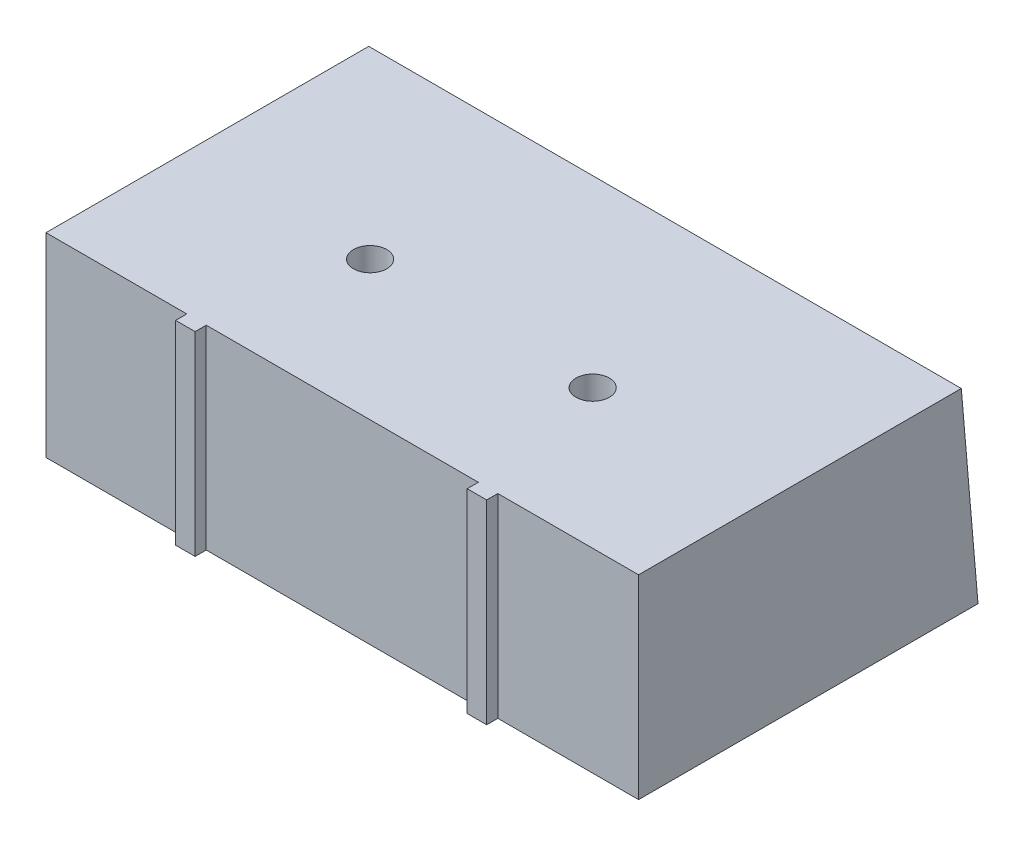
ISO-10303-21;
HEADER;
FILE_DESCRIPTION(('STEP AP214'),'2;1');
FILE_NAME('part.step','',(''),(''),'','','');
FILE_SCHEMA(('AUTOMOTIVE_DESIGN { 1 0 10303 214 1 1 1 1 }'));
ENDSEC;
DATA;
#1=APPLICATION_CONTEXT('core data for automotive mechanical design processes');
#2=APPLICATION_PROTOCOL_DEFINITION('international standard','automotive_design',2000,#1);
#3=PRODUCT_CONTEXT('',#1,'mechanical');
#4=PRODUCT('Part','Part','',(#3));
#5=PRODUCT_RELATED_PRODUCT_CATEGORY('part','',(#4));
#6=PRODUCT_DEFINITION_FORMATION('','',#4);
#7=PRODUCT_DEFINITION_CONTEXT('part definition',#1,'design');
#8=PRODUCT_DEFINITION('design','',#6,#7);
#9=PRODUCT_DEFINITION_SHAPE('','',#8);
#10=(LENGTH_UNIT() NAMED_UNIT(*) SI_UNIT(.MILLI.,.METRE.));
#11=(NAMED_UNIT(*) PLANE_ANGLE_UNIT() SI_UNIT($,.RADIAN.));
#12=(NAMED_UNIT(*) SI_UNIT($,.STERADIAN.) SOLID_ANGLE_UNIT());
#13=UNCERTAINTY_MEASURE_WITH_UNIT(LENGTH_MEASURE(1.E-05),#10,'distance_accuracy_value','');
#14=(GEOMETRIC_REPRESENTATION_CONTEXT(3) GLOBAL_UNCERTAINTY_ASSIGNED_CONTEXT((#13)) GLOBAL_UNIT_ASSIGNED_CONTEXT((#10,
#11,#12)) REPRESENTATION_CONTEXT('',''));
#15=CARTESIAN_POINT('',(0.,0.,0.));
#16=DIRECTION('',(0.,0.,1.));
#17=DIRECTION('',(1.,0.,0.));
#18=AXIS2_PLACEMENT_3D('',#15,#16,#17);
#19=CARTESIAN_POINT('',(0.,35.,0.));
#20=DIRECTION('',(0.,-1.,0.));
#21=DIRECTION('',(0.,0.,-1.));
#22=AXIS2_PLACEMENT_3D('',#19,#20,#21);
#23=PLANE('',#22);
#24=DIRECTION('',(0.,0.,-1.));
#25=VECTOR('',#24,1.);
#26=CARTESIAN_POINT('',(106.5,35.,0.));
#27=LINE('',#26,#25);
#28=CARTESIAN_POINT('',(106.5,35.,0.));
#29=VERTEX_POINT('',#28);
#30=CARTESIAN_POINT('',(106.5,35.,-58.));
#31=VERTEX_POINT('',#30);
#32=EDGE_CURVE('E169',#29,#31,#27,.T.);
#33=ORIENTED_EDGE('',*,*,#32,.T.);
#34=DIRECTION('',(-1.,0.,0.));
#35=VECTOR('',#34,1.);
#36=CARTESIAN_POINT('',(106.5,35.,-58.));
#37=LINE('',#36,#35);
#38=CARTESIAN_POINT('',(0.,35.,-58.));
#39=VERTEX_POINT('',#38);
#40=EDGE_CURVE('E291',#31,#39,#37,.T.);
#41=ORIENTED_EDGE('',*,*,#40,.T.);
#42=DIRECTION('',(0.,0.,1.));
#43=VECTOR('',#42,1.);
#44=CARTESIAN_POINT('',(0.,35.,0.));
#45=LINE('',#44,#43);
#46=CARTESIAN_POINT('',(0.,35.,0.));
#47=VERTEX_POINT('',#46);
#48=EDGE_CURVE('E119',#39,#47,#45,.T.);
#49=ORIENTED_EDGE('',*,*,#48,.T.);
#50=DIRECTION('',(1.,0.,0.));
#51=VECTOR('',#50,1.);
#52=CARTESIAN_POINT('',(0.,35.,0.));
#53=LINE('',#52,#51);
#54=CARTESIAN_POINT('',(25.3,35.,0.));
#55=VERTEX_POINT('',#54);
#56=EDGE_CURVE('E257',#47,#55,#53,.T.);
#57=ORIENTED_EDGE('',*,*,#56,.T.);
#58=DIRECTION('',(0.,0.,1.));
#59=VECTOR('',#58,1.);
#60=CARTESIAN_POINT('',(25.3,35.,0.));
#61=LINE('',#60,#59);
#62=CARTESIAN_POINT('',(25.3,35.,2.));
#63=VERTEX_POINT('',#62);
#64=EDGE_CURVE('E260',#55,#63,#61,.T.);
#65=ORIENTED_EDGE('',*,*,#64,.T.);
#66=DIRECTION('',(1.,0.,0.));
#67=VECTOR('',#66,1.);
#68=CARTESIAN_POINT('',(25.3,35.,2.));
#69=LINE('',#68,#67);
#70=CARTESIAN_POINT('',(28.8,35.,2.));
#71=VERTEX_POINT('',#70);
#72=EDGE_CURVE('E263',#63,#71,#69,.T.);
#73=ORIENTED_EDGE('',*,*,#72,.T.);
#74=DIRECTION('',(0.,0.,-1.));
#75=VECTOR('',#74,1.);
#76=CARTESIAN_POINT('',(28.8,35.,2.));
#77=LINE('',#76,#75);
#78=CARTESIAN_POINT('',(28.8,35.,0.));
#79=VERTEX_POINT('',#78);
#80=EDGE_CURVE('E266',#71,#79,#77,.T.);
#81=ORIENTED_EDGE('',*,*,#80,.T.);
#82=DIRECTION('',(1.,0.,0.));
#83=VECTOR('',#82,1.);
#84=CARTESIAN_POINT('',(28.8,35.,0.));
#85=LINE('',#84,#83);
#86=CARTESIAN_POINT('',(77.7,35.,0.));
#87=VERTEX_POINT('',#86);
#88=EDGE_CURVE('E269',#79,#87,#85,.T.);
#89=ORIENTED_EDGE('',*,*,#88,.T.);
#90=DIRECTION('',(0.,0.,1.));
#91=VECTOR('',#90,1.);
#92=CARTESIAN_POINT('',(77.7,35.,1.99999999999999));
#93=LINE('',#92,#91);
#94=CARTESIAN_POINT('',(77.7,35.,1.99999999999999));
#95=VERTEX_POINT('',#94);
#96=EDGE_CURVE('E148',#87,#95,#93,.T.);
#97=ORIENTED_EDGE('',*,*,#96,.T.);
#98=DIRECTION('',(1.,0.,0.));
#99=VECTOR('',#98,1.);
#100=CARTESIAN_POINT('',(81.2,35.,1.99999999999999));
#101=LINE('',#100,#99);
#102=CARTESIAN_POINT('',(81.2,35.,1.99999999999999));
#103=VERTEX_POINT('',#102);
#104=EDGE_CURVE('E141',#95,#103,#101,.T.);
#105=ORIENTED_EDGE('',*,*,#104,.T.);
#106=DIRECTION('',(0.,0.,-1.));
#107=VECTOR('',#106,1.);
#108=CARTESIAN_POINT('',(81.2,35.,0.));
#109=LINE('',#108,#107);
#110=CARTESIAN_POINT('',(81.2,35.,0.));
#111=VERTEX_POINT('',#110);
#112=EDGE_CURVE('E145',#103,#111,#109,.T.);
#113=ORIENTED_EDGE('',*,*,#112,.T.);
#114=DIRECTION('',(1.,0.,0.));
#115=VECTOR('',#114,1.);
#116=CARTESIAN_POINT('',(81.2,35.,0.));
#117=LINE('',#116,#115);
#118=EDGE_CURVE('E65',#111,#29,#117,.T.);
#119=ORIENTED_EDGE('',*,*,#118,.T.);
#120=EDGE_LOOP('',(#33,#41,#49,#57,#65,#73,#81,#89,#97,#105,#113,#119));
#121=FACE_BOUND('',#120,.T.);
#122=CARTESIAN_POINT('',(33.25,35.,-25.));
#123=DIRECTION('',(0.,1.,0.));
#124=DIRECTION('',(0.,0.,1.));
#125=AXIS2_PLACEMENT_3D('',#122,#123,#124);
#126=CIRCLE('',#125,3.);
#127=CARTESIAN_POINT('',(33.25,35.,-22.));
#128=VERTEX_POINT('',#127);
#129=EDGE_CURVE('E236',#128,#128,#126,.T.);
#130=ORIENTED_EDGE('',*,*,#129,.F.);
#131=EDGE_LOOP('',(#130));
#132=FACE_BOUND('',#131,.T.);
#133=CARTESIAN_POINT('',(73.25,35.,-25.));
#134=DIRECTION('',(0.,1.,0.));
#135=DIRECTION('',(0.,0.,-1.));
#136=AXIS2_PLACEMENT_3D('',#133,#134,#135);
#137=CIRCLE('',#136,3.00000000000001);
#138=CARTESIAN_POINT('',(73.25,35.,-28.));
#139=VERTEX_POINT('',#138);
#140=EDGE_CURVE('E249',#139,#139,#137,.T.);
#141=ORIENTED_EDGE('',*,*,#140,.F.);
#142=EDGE_LOOP('',(#141));
#143=FACE_BOUND('',#142,.T.);
#144=ADVANCED_FACE('F45',(#121,#132,#143),#23,.F.);
#145=CARTESIAN_POINT('',(0.,0.,0.));
#146=DIRECTION('',(0.,-1.,0.));
#147=DIRECTION('',(0.,0.,-1.));
#148=AXIS2_PLACEMENT_3D('',#145,#146,#147);
#149=PLANE('',#148);
#150=CARTESIAN_POINT('',(33.25,0.,-25.));
#151=DIRECTION('',(0.,1.,0.));
#152=DIRECTION('',(0.,0.,1.));
#153=AXIS2_PLACEMENT_3D('',#150,#151,#152);
#154=CIRCLE('',#153,3.);
#155=CARTESIAN_POINT('',(33.25,0.,-22.));
#156=VERTEX_POINT('',#155);
#157=EDGE_CURVE('E243',#156,#156,#154,.T.);
#158=ORIENTED_EDGE('',*,*,#157,.T.);
#159=EDGE_LOOP('',(#158));
#160=FACE_BOUND('',#159,.T.);
#161=DIRECTION('',(0.,0.,1.));
#162=VECTOR('',#161,1.);
#163=CARTESIAN_POINT('',(0.,0.,0.));
#164=LINE('',#163,#162);
#165=CARTESIAN_POINT('',(0.,0.,-61.));
#166=VERTEX_POINT('',#165);
#167=CARTESIAN_POINT('',(0.,0.,0.));
#168=VERTEX_POINT('',#167);
#169=EDGE_CURVE('E180',#166,#168,#164,.T.);
#170=ORIENTED_EDGE('',*,*,#169,.F.);
#171=DIRECTION('',(-1.,0.,0.));
#172=VECTOR('',#171,1.);
#173=CARTESIAN_POINT('',(0.,0.,-61.));
#174=LINE('',#173,#172);
#175=CARTESIAN_POINT('',(106.5,0.,-61.));
#176=VERTEX_POINT('',#175);
#177=EDGE_CURVE('E205',#176,#166,#174,.T.);
#178=ORIENTED_EDGE('',*,*,#177,.F.);
#179=DIRECTION('',(0.,0.,-1.));
#180=VECTOR('',#179,1.);
#181=CARTESIAN_POINT('',(106.5,0.,0.));
#182=LINE('',#181,#180);
#183=CARTESIAN_POINT('',(106.5,0.,0.));
#184=VERTEX_POINT('',#183);
#185=EDGE_CURVE('E202',#184,#176,#182,.T.);
#186=ORIENTED_EDGE('',*,*,#185,.F.);
#187=DIRECTION('',(1.,0.,0.));
#188=VECTOR('',#187,1.);
#189=CARTESIAN_POINT('',(81.2,0.,0.));
#190=LINE('',#189,#188);
#191=CARTESIAN_POINT('',(81.2,0.,0.));
#192=VERTEX_POINT('',#191);
#193=EDGE_CURVE('E103',#192,#184,#190,.T.);
#194=ORIENTED_EDGE('',*,*,#193,.F.);
#195=DIRECTION('',(0.,0.,-1.));
#196=VECTOR('',#195,1.);
#197=CARTESIAN_POINT('',(81.2,0.,0.));
#198=LINE('',#197,#196);
#199=CARTESIAN_POINT('',(81.2,0.,1.99999999999999));
#200=VERTEX_POINT('',#199);
#201=EDGE_CURVE('E197',#200,#192,#198,.T.);
#202=ORIENTED_EDGE('',*,*,#201,.F.);
#203=DIRECTION('',(1.,0.,0.));
#204=VECTOR('',#203,1.);
#205=CARTESIAN_POINT('',(81.2,0.,1.99999999999999));
#206=LINE('',#205,#204);
#207=CARTESIAN_POINT('',(77.7,0.,1.99999999999999));
#208=VERTEX_POINT('',#207);
#209=EDGE_CURVE('E158',#208,#200,#206,.T.);
#210=ORIENTED_EDGE('',*,*,#209,.F.);
#211=DIRECTION('',(0.,0.,1.));
#212=VECTOR('',#211,1.);
#213=CARTESIAN_POINT('',(77.7,0.,1.99999999999999));
#214=LINE('',#213,#212);
#215=CARTESIAN_POINT('',(77.7,0.,0.));
#216=VERTEX_POINT('',#215);
#217=EDGE_CURVE('E192',#216,#208,#214,.T.);
#218=ORIENTED_EDGE('',*,*,#217,.F.);
#219=DIRECTION('',(1.,0.,0.));
#220=VECTOR('',#219,1.);
#221=CARTESIAN_POINT('',(28.8,0.,0.));
#222=LINE('',#221,#220);
#223=CARTESIAN_POINT('',(28.8,0.,0.));
#224=VERTEX_POINT('',#223);
#225=EDGE_CURVE('E189',#224,#216,#222,.T.);
#226=ORIENTED_EDGE('',*,*,#225,.F.);
#227=DIRECTION('',(0.,0.,-1.));
#228=VECTOR('',#227,1.);
#229=CARTESIAN_POINT('',(28.8,0.,2.));
#230=LINE('',#229,#228);
#231=CARTESIAN_POINT('',(28.8,0.,2.));
#232=VERTEX_POINT('',#231);
#233=EDGE_CURVE('E186',#232,#224,#230,.T.);
#234=ORIENTED_EDGE('',*,*,#233,.F.);
#235=DIRECTION('',(1.,0.,0.));
#236=VECTOR('',#235,1.);
#237=CARTESIAN_POINT('',(25.3,0.,2.));
#238=LINE('',#237,#236);
#239=CARTESIAN_POINT('',(25.3,0.,2.));
#240=VERTEX_POINT('',#239);
#241=EDGE_CURVE('E183',#240,#232,#238,.T.);
#242=ORIENTED_EDGE('',*,*,#241,.F.);
#243=DIRECTION('',(0.,0.,1.));
#244=VECTOR('',#243,1.);
#245=CARTESIAN_POINT('',(25.3,0.,0.));
#246=LINE('',#245,#244);
#247=CARTESIAN_POINT('',(25.3,0.,0.));
#248=VERTEX_POINT('',#247);
#249=EDGE_CURVE('E179',#248,#240,#246,.T.);
#250=ORIENTED_EDGE('',*,*,#249,.F.);
#251=DIRECTION('',(1.,0.,0.));
#252=VECTOR('',#251,1.);
#253=CARTESIAN_POINT('',(0.,0.,0.));
#254=LINE('',#253,#252);
#255=EDGE_CURVE('E176',#168,#248,#254,.T.);
#256=ORIENTED_EDGE('',*,*,#255,.F.);
#257=EDGE_LOOP('',(#170,#178,#186,#194,#202,#210,#218,#226,#234,#242,#250,#256));
#258=FACE_BOUND('',#257,.T.);
#259=CARTESIAN_POINT('',(73.25,0.,-25.));
#260=DIRECTION('',(0.,1.,0.));
#261=DIRECTION('',(0.,0.,-1.));
#262=AXIS2_PLACEMENT_3D('',#259,#260,#261);
#263=CIRCLE('',#262,3.00000000000001);
#264=CARTESIAN_POINT('',(73.25,0.,-28.));
#265=VERTEX_POINT('',#264);
#266=EDGE_CURVE('E252',#265,#265,#263,.T.);
#267=ORIENTED_EDGE('',*,*,#266,.T.);
#268=EDGE_LOOP('',(#267));
#269=FACE_BOUND('',#268,.T.);
#270=ADVANCED_FACE('F283',(#160,#258,#269),#149,.T.);
#271=CARTESIAN_POINT('',(0.,35.,0.));
#272=DIRECTION('',(1.,0.,0.));
#273=DIRECTION('',(0.,0.,-1.));
#274=AXIS2_PLACEMENT_3D('',#271,#272,#273);
#275=PLANE('',#274);
#276=ORIENTED_EDGE('',*,*,#48,.F.);
#277=DIRECTION('',(0.,-0.996346649041751,-0.0854011413464359));
#278=VECTOR('',#277,1.);
#279=CARTESIAN_POINT('',(0.,39.935170178282,-57.5769854132901));
#280=LINE('',#279,#278);
#281=EDGE_CURVE('E297',#39,#166,#280,.T.);
#282=ORIENTED_EDGE('',*,*,#281,.T.);
#283=ORIENTED_EDGE('',*,*,#169,.T.);
#284=DIRECTION('',(0.,-1.,0.));
#285=VECTOR('',#284,1.);
#286=CARTESIAN_POINT('',(0.,35.,0.));
#287=LINE('',#286,#285);
#288=EDGE_CURVE('E11',#47,#168,#287,.T.);
#289=ORIENTED_EDGE('',*,*,#288,.F.);
#290=EDGE_LOOP('',(#276,#282,#283,#289));
#291=FACE_BOUND('',#290,.T.);
#292=ADVANCED_FACE('F47',(#291),#275,.F.);
#293=CARTESIAN_POINT('',(0.,35.,0.));
#294=DIRECTION('',(0.,0.,-1.));
#295=DIRECTION('',(-1.,0.,0.));
#296=AXIS2_PLACEMENT_3D('',#293,#294,#295);
#297=PLANE('',#296);
#298=ORIENTED_EDGE('',*,*,#255,.T.);
#299=DIRECTION('',(0.,-1.,0.));
#300=VECTOR('',#299,1.);
#301=CARTESIAN_POINT('',(25.3,35.,0.));
#302=LINE('',#301,#300);
#303=EDGE_CURVE('E56',#55,#248,#302,.T.);
#304=ORIENTED_EDGE('',*,*,#303,.F.);
#305=ORIENTED_EDGE('',*,*,#56,.F.);
#306=ORIENTED_EDGE('',*,*,#288,.T.);
#307=EDGE_LOOP('',(#298,#304,#305,#306));
#308=FACE_BOUND('',#307,.T.);
#309=ADVANCED_FACE('F304',(#308),#297,.F.);
#310=CARTESIAN_POINT('',(25.3,35.,0.));
#311=DIRECTION('',(1.,0.,0.));
#312=DIRECTION('',(0.,0.,-1.));
#313=AXIS2_PLACEMENT_3D('',#310,#311,#312);
#314=PLANE('',#313);
#315=ORIENTED_EDGE('',*,*,#249,.T.);
#316=DIRECTION('',(0.,-1.,0.));
#317=VECTOR('',#316,1.);
#318=CARTESIAN_POINT('',(25.3,35.,2.));
#319=LINE('',#318,#317);
#320=EDGE_CURVE('E224',#63,#240,#319,.T.);
#321=ORIENTED_EDGE('',*,*,#320,.F.);
#322=ORIENTED_EDGE('',*,*,#64,.F.);
#323=ORIENTED_EDGE('',*,*,#303,.T.);
#324=EDGE_LOOP('',(#315,#321,#322,#323));
#325=FACE_BOUND('',#324,.T.);
#326=ADVANCED_FACE('F310',(#325),#314,.F.);
#327=CARTESIAN_POINT('',(25.3,35.,2.));
#328=DIRECTION('',(0.,0.,-1.));
#329=DIRECTION('',(-1.,0.,0.));
#330=AXIS2_PLACEMENT_3D('',#327,#328,#329);
#331=PLANE('',#330);
#332=ORIENTED_EDGE('',*,*,#241,.T.);
#333=DIRECTION('',(0.,-1.,0.));
#334=VECTOR('',#333,1.);
#335=CARTESIAN_POINT('',(28.8,35.,2.));
#336=LINE('',#335,#334);
#337=EDGE_CURVE('E220',#71,#232,#336,.T.);
#338=ORIENTED_EDGE('',*,*,#337,.F.);
#339=ORIENTED_EDGE('',*,*,#72,.F.);
#340=ORIENTED_EDGE('',*,*,#320,.T.);
#341=EDGE_LOOP('',(#332,#338,#339,#340));
#342=FACE_BOUND('',#341,.T.);
#343=ADVANCED_FACE('F312',(#342),#331,.F.);
#344=CARTESIAN_POINT('',(28.8,35.,2.));
#345=DIRECTION('',(-1.,0.,0.));
#346=DIRECTION('',(0.,0.,1.));
#347=AXIS2_PLACEMENT_3D('',#344,#345,#346);
#348=PLANE('',#347);
#349=ORIENTED_EDGE('',*,*,#233,.T.);
#350=DIRECTION('',(0.,-1.,0.));
#351=VECTOR('',#350,1.);
#352=CARTESIAN_POINT('',(28.8,35.,0.));
#353=LINE('',#352,#351);
#354=EDGE_CURVE('E216',#79,#224,#353,.T.);
#355=ORIENTED_EDGE('',*,*,#354,.F.);
#356=ORIENTED_EDGE('',*,*,#80,.F.);
#357=ORIENTED_EDGE('',*,*,#337,.T.);
#358=EDGE_LOOP('',(#349,#355,#356,#357));
#359=FACE_BOUND('',#358,.T.);
#360=ADVANCED_FACE('F315',(#359),#348,.F.);
#361=CARTESIAN_POINT('',(28.8,35.,0.));
#362=DIRECTION('',(0.,0.,-1.));
#363=DIRECTION('',(-1.,0.,0.));
#364=AXIS2_PLACEMENT_3D('',#361,#362,#363);
#365=PLANE('',#364);
#366=ORIENTED_EDGE('',*,*,#225,.T.);
#367=DIRECTION('',(0.,-1.,0.));
#368=VECTOR('',#367,1.);
#369=CARTESIAN_POINT('',(77.7,35.,0.));
#370=LINE('',#369,#368);
#371=EDGE_CURVE('E212',#87,#216,#370,.T.);
#372=ORIENTED_EDGE('',*,*,#371,.F.);
#373=ORIENTED_EDGE('',*,*,#88,.F.);
#374=ORIENTED_EDGE('',*,*,#354,.T.);
#375=EDGE_LOOP('',(#366,#372,#373,#374));
#376=FACE_BOUND('',#375,.T.);
#377=ADVANCED_FACE('F277',(#376),#365,.F.);
#378=CARTESIAN_POINT('',(77.7,35.,1.99999999999999));
#379=DIRECTION('',(1.,0.,0.));
#380=DIRECTION('',(0.,0.,-1.));
#381=AXIS2_PLACEMENT_3D('',#378,#379,#380);
#382=PLANE('',#381);
#383=ORIENTED_EDGE('',*,*,#217,.T.);
#384=DIRECTION('',(0.,-1.,0.));
#385=VECTOR('',#384,1.);
#386=CARTESIAN_POINT('',(77.7,35.,1.99999999999999));
#387=LINE('',#386,#385);
#388=EDGE_CURVE('E162',#95,#208,#387,.T.);
#389=ORIENTED_EDGE('',*,*,#388,.F.);
#390=ORIENTED_EDGE('',*,*,#96,.F.);
#391=ORIENTED_EDGE('',*,*,#371,.T.);
#392=EDGE_LOOP('',(#383,#389,#390,#391));
#393=FACE_BOUND('',#392,.T.);
#394=ADVANCED_FACE('F281',(#393),#382,.F.);
#395=CARTESIAN_POINT('',(81.2,35.,1.99999999999999));
#396=DIRECTION('',(0.,0.,-1.));
#397=DIRECTION('',(-1.,0.,0.));
#398=AXIS2_PLACEMENT_3D('',#395,#396,#397);
#399=PLANE('',#398);
#400=ORIENTED_EDGE('',*,*,#209,.T.);
#401=DIRECTION('',(0.,-1.,0.));
#402=VECTOR('',#401,1.);
#403=CARTESIAN_POINT('',(81.2,35.,1.99999999999999));
#404=LINE('',#403,#402);
#405=EDGE_CURVE('E155',#103,#200,#404,.T.);
#406=ORIENTED_EDGE('',*,*,#405,.F.);
#407=ORIENTED_EDGE('',*,*,#104,.F.);
#408=ORIENTED_EDGE('',*,*,#388,.T.);
#409=EDGE_LOOP('',(#400,#406,#407,#408));
#410=FACE_BOUND('',#409,.T.);
#411=ADVANCED_FACE('F156',(#410),#399,.F.);
#412=CARTESIAN_POINT('',(81.2,35.,0.));
#413=DIRECTION('',(-1.,0.,0.));
#414=DIRECTION('',(0.,0.,1.));
#415=AXIS2_PLACEMENT_3D('',#412,#413,#414);
#416=PLANE('',#415);
#417=ORIENTED_EDGE('',*,*,#201,.T.);
#418=DIRECTION('',(0.,-1.,0.));
#419=VECTOR('',#418,1.);
#420=CARTESIAN_POINT('',(81.2,35.,0.));
#421=LINE('',#420,#419);
#422=EDGE_CURVE('E163',#111,#192,#421,.T.);
#423=ORIENTED_EDGE('',*,*,#422,.F.);
#424=ORIENTED_EDGE('',*,*,#112,.F.);
#425=ORIENTED_EDGE('',*,*,#405,.T.);
#426=EDGE_LOOP('',(#417,#423,#424,#425));
#427=FACE_BOUND('',#426,.T.);
#428=ADVANCED_FACE('F165',(#427),#416,.F.);
#429=CARTESIAN_POINT('',(81.2,35.,0.));
#430=DIRECTION('',(0.,0.,-1.));
#431=DIRECTION('',(-1.,0.,0.));
#432=AXIS2_PLACEMENT_3D('',#429,#430,#431);
#433=PLANE('',#432);
#434=ORIENTED_EDGE('',*,*,#193,.T.);
#435=DIRECTION('',(0.,-1.,0.));
#436=VECTOR('',#435,1.);
#437=CARTESIAN_POINT('',(106.5,35.,0.));
#438=LINE('',#437,#436);
#439=EDGE_CURVE('E175',#29,#184,#438,.T.);
#440=ORIENTED_EDGE('',*,*,#439,.F.);
#441=ORIENTED_EDGE('',*,*,#118,.F.);
#442=ORIENTED_EDGE('',*,*,#422,.T.);
#443=EDGE_LOOP('',(#434,#440,#441,#442));
#444=FACE_BOUND('',#443,.T.);
#445=ADVANCED_FACE('F286',(#444),#433,.F.);
#446=CARTESIAN_POINT('',(106.5,35.,0.));
#447=DIRECTION('',(-1.,0.,0.));
#448=DIRECTION('',(0.,0.,1.));
#449=AXIS2_PLACEMENT_3D('',#446,#447,#448);
#450=PLANE('',#449);
#451=ORIENTED_EDGE('',*,*,#185,.T.);
#452=DIRECTION('',(0.,0.996346649041751,0.0854011413464359));
#453=VECTOR('',#452,1.);
#454=CARTESIAN_POINT('',(106.5,35.,-58.));
#455=LINE('',#454,#453);
#456=EDGE_CURVE('E111',#176,#31,#455,.T.);
#457=ORIENTED_EDGE('',*,*,#456,.T.);
#458=ORIENTED_EDGE('',*,*,#32,.F.);
#459=ORIENTED_EDGE('',*,*,#439,.T.);
#460=EDGE_LOOP('',(#451,#457,#458,#459));
#461=FACE_BOUND('',#460,.T.);
#462=ADVANCED_FACE('F289',(#461),#450,.F.);
#463=CARTESIAN_POINT('',(33.25,35.,-25.));
#464=DIRECTION('',(0.,-1.,0.));
#465=DIRECTION('',(0.,0.,-1.));
#466=AXIS2_PLACEMENT_3D('',#463,#464,#465);
#467=CYLINDRICAL_SURFACE('',#466,3.);
#468=ORIENTED_EDGE('',*,*,#129,.T.);
#469=EDGE_LOOP('',(#468));
#470=FACE_BOUND('',#469,.T.);
#471=ORIENTED_EDGE('',*,*,#157,.F.);
#472=EDGE_LOOP('',(#471));
#473=FACE_BOUND('',#472,.T.);
#474=ADVANCED_FACE('F333',(#470,#473),#467,.F.);
#475=CARTESIAN_POINT('',(73.25,35.,-25.));
#476=DIRECTION('',(0.,-1.,0.));
#477=DIRECTION('',(0.,0.,-1.));
#478=AXIS2_PLACEMENT_3D('',#475,#476,#477);
#479=CYLINDRICAL_SURFACE('',#478,3.00000000000001);
#480=ORIENTED_EDGE('',*,*,#140,.T.);
#481=EDGE_LOOP('',(#480));
#482=FACE_BOUND('',#481,.T.);
#483=ORIENTED_EDGE('',*,*,#266,.F.);
#484=EDGE_LOOP('',(#483));
#485=FACE_BOUND('',#484,.T.);
#486=ADVANCED_FACE('F371',(#482,#485),#479,.F.);
#487=CARTESIAN_POINT('',(106.5,35.,-58.));
#488=DIRECTION('',(0.,-0.0854011413464359,0.996346649041751));
#489=DIRECTION('',(0.,-0.996346649041751,-0.0854011413464359));
#490=AXIS2_PLACEMENT_3D('',#487,#488,#489);
#491=PLANE('',#490);
#492=ORIENTED_EDGE('',*,*,#40,.F.);
#493=ORIENTED_EDGE('',*,*,#456,.F.);
#494=ORIENTED_EDGE('',*,*,#177,.T.);
#495=ORIENTED_EDGE('',*,*,#281,.F.);
#496=EDGE_LOOP('',(#492,#493,#494,#495));
#497=FACE_BOUND('',#496,.T.);
#498=ADVANCED_FACE('F296',(#497),#491,.F.);
#499=CLOSED_SHELL('',(#144,#270,#292,#309,#326,#343,#360,#377,#394,#411,#428,#445,#462,#474,
#486,#498));
#500=MANIFOLD_SOLID_BREP('B2',#499);
#501=ADVANCED_BREP_SHAPE_REPRESENTATION('',(#18,#500),#14);
#502=SHAPE_DEFINITION_REPRESENTATION(#9,#501);
ENDSEC;
END-ISO-10303-21;
